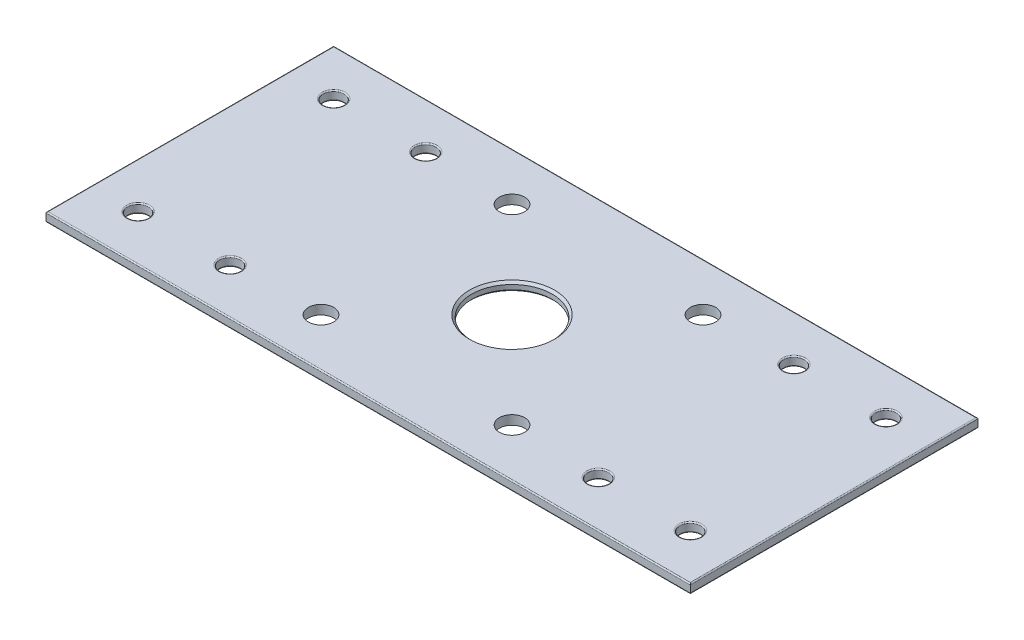
ISO-10303-21;
HEADER;
FILE_DESCRIPTION(('STEP AP214'),'2;1');
FILE_NAME('part.step','',(''),(''),'','','');
FILE_SCHEMA(('AUTOMOTIVE_DESIGN { 1 0 10303 214 1 1 1 1 }'));
ENDSEC;
DATA;
#1=APPLICATION_CONTEXT('core data for automotive mechanical design processes');
#2=APPLICATION_PROTOCOL_DEFINITION('international standard','automotive_design',2000,#1);
#3=PRODUCT_CONTEXT('',#1,'mechanical');
#4=PRODUCT('Part','Part','',(#3));
#5=PRODUCT_RELATED_PRODUCT_CATEGORY('part','',(#4));
#6=PRODUCT_DEFINITION_FORMATION('','',#4);
#7=PRODUCT_DEFINITION_CONTEXT('part definition',#1,'design');
#8=PRODUCT_DEFINITION('design','',#6,#7);
#9=PRODUCT_DEFINITION_SHAPE('','',#8);
#10=(LENGTH_UNIT() NAMED_UNIT(*) SI_UNIT(.MILLI.,.METRE.));
#11=(NAMED_UNIT(*) PLANE_ANGLE_UNIT() SI_UNIT($,.RADIAN.));
#12=(NAMED_UNIT(*) SI_UNIT($,.STERADIAN.) SOLID_ANGLE_UNIT());
#13=UNCERTAINTY_MEASURE_WITH_UNIT(LENGTH_MEASURE(1.E-05),#10,'distance_accuracy_value','');
#14=(GEOMETRIC_REPRESENTATION_CONTEXT(3) GLOBAL_UNCERTAINTY_ASSIGNED_CONTEXT((#13)) GLOBAL_UNIT_ASSIGNED_CONTEXT((#10,
#11,#12)) REPRESENTATION_CONTEXT('',''));
#15=CARTESIAN_POINT('',(0.,0.,0.));
#16=DIRECTION('',(0.,0.,1.));
#17=DIRECTION('',(1.,0.,0.));
#18=AXIS2_PLACEMENT_3D('',#15,#16,#17);
#19=CARTESIAN_POINT('',(0.,4.,0.));
#20=DIRECTION('',(0.,-1.,0.));
#21=DIRECTION('',(0.,0.,-1.));
#22=AXIS2_PLACEMENT_3D('',#19,#20,#21);
#23=PLANE('',#22);
#24=CARTESIAN_POINT('',(0.,4.,0.));
#25=DIRECTION('',(0.,-1.,0.));
#26=DIRECTION('',(0.,0.,-1.));
#27=AXIS2_PLACEMENT_3D('',#24,#25,#26);
#28=CIRCLE('',#27,18.5);
#29=CARTESIAN_POINT('',(0.,4.,-18.5));
#30=VERTEX_POINT('',#29);
#31=EDGE_CURVE('E11',#30,#30,#28,.T.);
#32=ORIENTED_EDGE('',*,*,#31,.T.);
#33=EDGE_LOOP('',(#32));
#34=FACE_BOUND('',#33,.T.);
#35=CARTESIAN_POINT('',(41.5,4.,-41.5));
#36=DIRECTION('',(0.,1.,0.));
#37=DIRECTION('',(0.,0.,1.));
#38=AXIS2_PLACEMENT_3D('',#35,#36,#37);
#39=CIRCLE('',#38,5.5);
#40=CARTESIAN_POINT('',(41.5,4.,-36.));
#41=VERTEX_POINT('',#40);
#42=EDGE_CURVE('E155',#41,#41,#39,.T.);
#43=ORIENTED_EDGE('',*,*,#42,.F.);
#44=EDGE_LOOP('',(#43));
#45=FACE_BOUND('',#44,.T.);
#46=CARTESIAN_POINT('',(-41.5,4.,-41.5));
#47=DIRECTION('',(0.,1.,0.));
#48=DIRECTION('',(0.,0.,1.));
#49=AXIS2_PLACEMENT_3D('',#46,#47,#48);
#50=CIRCLE('',#49,5.5);
#51=CARTESIAN_POINT('',(-41.5,4.,-36.));
#52=VERTEX_POINT('',#51);
#53=EDGE_CURVE('E151',#52,#52,#50,.T.);
#54=ORIENTED_EDGE('',*,*,#53,.F.);
#55=EDGE_LOOP('',(#54));
#56=FACE_BOUND('',#55,.T.);
#57=CARTESIAN_POINT('',(-41.5,4.,41.5));
#58=DIRECTION('',(0.,1.,0.));
#59=DIRECTION('',(0.,0.,1.));
#60=AXIS2_PLACEMENT_3D('',#57,#58,#59);
#61=CIRCLE('',#60,5.5);
#62=CARTESIAN_POINT('',(-41.5,4.,47.));
#63=VERTEX_POINT('',#62);
#64=EDGE_CURVE('E150',#63,#63,#61,.T.);
#65=ORIENTED_EDGE('',*,*,#64,.F.);
#66=EDGE_LOOP('',(#65));
#67=FACE_BOUND('',#66,.T.);
#68=DIRECTION('',(0.,0.,1.));
#69=VECTOR('',#68,1.);
#70=CARTESIAN_POINT('',(-139.5,4.,0.));
#71=LINE('',#70,#69);
#72=CARTESIAN_POINT('',(-139.5,4.,-62.));
#73=VERTEX_POINT('',#72);
#74=CARTESIAN_POINT('',(-139.5,4.,62.));
#75=VERTEX_POINT('',#74);
#76=EDGE_CURVE('E56',#73,#75,#71,.T.);
#77=ORIENTED_EDGE('',*,*,#76,.T.);
#78=DIRECTION('',(1.,0.,0.));
#79=VECTOR('',#78,1.);
#80=CARTESIAN_POINT('',(0.,4.,62.));
#81=LINE('',#80,#79);
#82=CARTESIAN_POINT('',(139.5,4.,62.));
#83=VERTEX_POINT('',#82);
#84=EDGE_CURVE('E160',#75,#83,#81,.T.);
#85=ORIENTED_EDGE('',*,*,#84,.T.);
#86=DIRECTION('',(0.,0.,-1.));
#87=VECTOR('',#86,1.);
#88=CARTESIAN_POINT('',(139.5,4.,0.));
#89=LINE('',#88,#87);
#90=CARTESIAN_POINT('',(139.5,4.,-62.));
#91=VERTEX_POINT('',#90);
#92=EDGE_CURVE('E325',#83,#91,#89,.T.);
#93=ORIENTED_EDGE('',*,*,#92,.T.);
#94=DIRECTION('',(-1.,0.,0.));
#95=VECTOR('',#94,1.);
#96=CARTESIAN_POINT('',(0.,4.,-62.));
#97=LINE('',#96,#95);
#98=EDGE_CURVE('E61',#91,#73,#97,.T.);
#99=ORIENTED_EDGE('',*,*,#98,.T.);
#100=EDGE_LOOP('',(#77,#85,#93,#99));
#101=FACE_BOUND('',#100,.T.);
#102=CARTESIAN_POINT('',(120.,4.,-42.5));
#103=DIRECTION('',(0.,-1.,0.));
#104=DIRECTION('',(0.,0.,-1.));
#105=AXIS2_PLACEMENT_3D('',#102,#103,#104);
#106=CIRCLE('',#105,4.99999999999999);
#107=CARTESIAN_POINT('',(120.,4.,-47.5));
#108=VERTEX_POINT('',#107);
#109=EDGE_CURVE('E322',#108,#108,#106,.T.);
#110=ORIENTED_EDGE('',*,*,#109,.T.);
#111=EDGE_LOOP('',(#110));
#112=FACE_BOUND('',#111,.T.);
#113=CARTESIAN_POINT('',(79.9999999999999,4.,-42.5));
#114=DIRECTION('',(0.,-1.,0.));
#115=DIRECTION('',(0.,0.,-1.));
#116=AXIS2_PLACEMENT_3D('',#113,#114,#115);
#117=CIRCLE('',#116,4.99999999999999);
#118=CARTESIAN_POINT('',(79.9999999999999,4.,-47.5));
#119=VERTEX_POINT('',#118);
#120=EDGE_CURVE('E319',#119,#119,#117,.T.);
#121=ORIENTED_EDGE('',*,*,#120,.T.);
#122=EDGE_LOOP('',(#121));
#123=FACE_BOUND('',#122,.T.);
#124=CARTESIAN_POINT('',(79.9999999999999,4.,42.5));
#125=DIRECTION('',(0.,-1.,0.));
#126=DIRECTION('',(0.,0.,-1.));
#127=AXIS2_PLACEMENT_3D('',#124,#125,#126);
#128=CIRCLE('',#127,4.99999999999999);
#129=CARTESIAN_POINT('',(79.9999999999999,4.,37.5));
#130=VERTEX_POINT('',#129);
#131=EDGE_CURVE('E316',#130,#130,#128,.T.);
#132=ORIENTED_EDGE('',*,*,#131,.T.);
#133=EDGE_LOOP('',(#132));
#134=FACE_BOUND('',#133,.T.);
#135=CARTESIAN_POINT('',(120.,4.,42.5));
#136=DIRECTION('',(0.,-1.,0.));
#137=DIRECTION('',(0.,0.,-1.));
#138=AXIS2_PLACEMENT_3D('',#135,#136,#137);
#139=CIRCLE('',#138,4.99999999999999);
#140=CARTESIAN_POINT('',(120.,4.,37.5));
#141=VERTEX_POINT('',#140);
#142=EDGE_CURVE('E313',#141,#141,#139,.T.);
#143=ORIENTED_EDGE('',*,*,#142,.T.);
#144=EDGE_LOOP('',(#143));
#145=FACE_BOUND('',#144,.T.);
#146=CARTESIAN_POINT('',(-120.,4.,42.4999999999999));
#147=DIRECTION('',(0.,-1.,0.));
#148=DIRECTION('',(0.,0.,-1.));
#149=AXIS2_PLACEMENT_3D('',#146,#147,#148);
#150=CIRCLE('',#149,4.99999999999999);
#151=CARTESIAN_POINT('',(-120.,4.,37.4999999999999));
#152=VERTEX_POINT('',#151);
#153=EDGE_CURVE('E310',#152,#152,#150,.T.);
#154=ORIENTED_EDGE('',*,*,#153,.T.);
#155=EDGE_LOOP('',(#154));
#156=FACE_BOUND('',#155,.T.);
#157=CARTESIAN_POINT('',(-79.9999999999999,4.,42.4999999999999));
#158=DIRECTION('',(0.,-1.,0.));
#159=DIRECTION('',(0.,0.,-1.));
#160=AXIS2_PLACEMENT_3D('',#157,#158,#159);
#161=CIRCLE('',#160,4.99999999999999);
#162=CARTESIAN_POINT('',(-79.9999999999999,4.,37.4999999999999));
#163=VERTEX_POINT('',#162);
#164=EDGE_CURVE('E307',#163,#163,#161,.T.);
#165=ORIENTED_EDGE('',*,*,#164,.T.);
#166=EDGE_LOOP('',(#165));
#167=FACE_BOUND('',#166,.T.);
#168=CARTESIAN_POINT('',(-79.9999999999999,4.,-42.4999999999999));
#169=DIRECTION('',(0.,-1.,0.));
#170=DIRECTION('',(0.,0.,-1.));
#171=AXIS2_PLACEMENT_3D('',#168,#169,#170);
#172=CIRCLE('',#171,4.99999999999999);
#173=CARTESIAN_POINT('',(-79.9999999999999,4.,-47.4999999999999));
#174=VERTEX_POINT('',#173);
#175=EDGE_CURVE('E304',#174,#174,#172,.T.);
#176=ORIENTED_EDGE('',*,*,#175,.T.);
#177=EDGE_LOOP('',(#176));
#178=FACE_BOUND('',#177,.T.);
#179=CARTESIAN_POINT('',(-120.,4.,-42.4999999999999));
#180=DIRECTION('',(0.,-1.,0.));
#181=DIRECTION('',(0.,0.,-1.));
#182=AXIS2_PLACEMENT_3D('',#179,#180,#181);
#183=CIRCLE('',#182,4.99999999999999);
#184=CARTESIAN_POINT('',(-120.,4.,-47.4999999999999));
#185=VERTEX_POINT('',#184);
#186=EDGE_CURVE('E301',#185,#185,#183,.T.);
#187=ORIENTED_EDGE('',*,*,#186,.T.);
#188=EDGE_LOOP('',(#187));
#189=FACE_BOUND('',#188,.T.);
#190=CARTESIAN_POINT('',(41.5,4.,41.5));
#191=DIRECTION('',(0.,1.,0.));
#192=DIRECTION('',(0.,0.,1.));
#193=AXIS2_PLACEMENT_3D('',#190,#191,#192);
#194=CIRCLE('',#193,5.5);
#195=CARTESIAN_POINT('',(41.5,4.,47.));
#196=VERTEX_POINT('',#195);
#197=EDGE_CURVE('E834',#196,#196,#194,.T.);
#198=ORIENTED_EDGE('',*,*,#197,.F.);
#199=EDGE_LOOP('',(#198));
#200=FACE_BOUND('',#199,.T.);
#201=ADVANCED_FACE('F40',(#34,#45,#56,#67,#101,#112,#123,#134,#145,#156,#167,#178,#189,#200),
#23,.F.);
#202=CARTESIAN_POINT('',(140.,4.,62.5));
#203=DIRECTION('',(-1.,0.,0.));
#204=DIRECTION('',(0.,0.,1.));
#205=AXIS2_PLACEMENT_3D('',#202,#203,#204);
#206=PLANE('',#205);
#207=DIRECTION('',(0.,-1.,0.));
#208=VECTOR('',#207,1.);
#209=CARTESIAN_POINT('',(140.,4.,62.5));
#210=LINE('',#209,#208);
#211=CARTESIAN_POINT('',(140.,3.5,62.5));
#212=VERTEX_POINT('',#211);
#213=CARTESIAN_POINT('',(140.,0.5,62.5));
#214=VERTEX_POINT('',#213);
#215=EDGE_CURVE('E337',#212,#214,#210,.T.);
#216=ORIENTED_EDGE('',*,*,#215,.T.);
#217=DIRECTION('',(0.,0.,-1.));
#218=VECTOR('',#217,1.);
#219=CARTESIAN_POINT('',(140.,0.5,-62.5));
#220=LINE('',#219,#218);
#221=CARTESIAN_POINT('',(140.,0.5,-62.5));
#222=VERTEX_POINT('',#221);
#223=EDGE_CURVE('E251',#214,#222,#220,.T.);
#224=ORIENTED_EDGE('',*,*,#223,.T.);
#225=DIRECTION('',(0.,-1.,0.));
#226=VECTOR('',#225,1.);
#227=CARTESIAN_POINT('',(140.,4.,-62.5));
#228=LINE('',#227,#226);
#229=CARTESIAN_POINT('',(140.,3.5,-62.5));
#230=VERTEX_POINT('',#229);
#231=EDGE_CURVE('E128',#230,#222,#228,.T.);
#232=ORIENTED_EDGE('',*,*,#231,.F.);
#233=DIRECTION('',(0.,0.,-1.));
#234=VECTOR('',#233,1.);
#235=CARTESIAN_POINT('',(140.,3.5,62.5));
#236=LINE('',#235,#234);
#237=EDGE_CURVE('E249',#230,#212,#236,.F.);
#238=ORIENTED_EDGE('',*,*,#237,.T.);
#239=EDGE_LOOP('',(#216,#224,#232,#238));
#240=FACE_BOUND('',#239,.T.);
#241=ADVANCED_FACE('F351',(#240),#206,.F.);
#242=CARTESIAN_POINT('',(-140.,4.,-62.5));
#243=DIRECTION('',(0.,0.,1.));
#244=DIRECTION('',(1.,0.,0.));
#245=AXIS2_PLACEMENT_3D('',#242,#243,#244);
#246=PLANE('',#245);
#247=ORIENTED_EDGE('',*,*,#231,.T.);
#248=DIRECTION('',(-1.,0.,0.));
#249=VECTOR('',#248,1.);
#250=CARTESIAN_POINT('',(-140.,0.5,-62.5));
#251=LINE('',#250,#249);
#252=CARTESIAN_POINT('',(-140.,0.5,-62.5));
#253=VERTEX_POINT('',#252);
#254=EDGE_CURVE('E127',#222,#253,#251,.T.);
#255=ORIENTED_EDGE('',*,*,#254,.T.);
#256=DIRECTION('',(0.,-1.,0.));
#257=VECTOR('',#256,1.);
#258=CARTESIAN_POINT('',(-140.,4.,-62.5));
#259=LINE('',#258,#257);
#260=CARTESIAN_POINT('',(-140.,3.5,-62.5));
#261=VERTEX_POINT('',#260);
#262=EDGE_CURVE('E110',#261,#253,#259,.T.);
#263=ORIENTED_EDGE('',*,*,#262,.F.);
#264=DIRECTION('',(-1.,0.,0.));
#265=VECTOR('',#264,1.);
#266=CARTESIAN_POINT('',(-140.,3.5,-62.5));
#267=LINE('',#266,#265);
#268=EDGE_CURVE('E124',#261,#230,#267,.F.);
#269=ORIENTED_EDGE('',*,*,#268,.T.);
#270=EDGE_LOOP('',(#247,#255,#263,#269));
#271=FACE_BOUND('',#270,.T.);
#272=ADVANCED_FACE('F123',(#271),#246,.F.);
#273=CARTESIAN_POINT('',(-140.,4.,62.5));
#274=DIRECTION('',(1.,0.,0.));
#275=DIRECTION('',(0.,0.,-1.));
#276=AXIS2_PLACEMENT_3D('',#273,#274,#275);
#277=PLANE('',#276);
#278=ORIENTED_EDGE('',*,*,#262,.T.);
#279=DIRECTION('',(0.,0.,1.));
#280=VECTOR('',#279,1.);
#281=CARTESIAN_POINT('',(-140.,0.5,62.5));
#282=LINE('',#281,#280);
#283=CARTESIAN_POINT('',(-140.,0.5,62.5));
#284=VERTEX_POINT('',#283);
#285=EDGE_CURVE('E116',#253,#284,#282,.T.);
#286=ORIENTED_EDGE('',*,*,#285,.T.);
#287=DIRECTION('',(0.,-1.,0.));
#288=VECTOR('',#287,1.);
#289=CARTESIAN_POINT('',(-140.,4.,62.5));
#290=LINE('',#289,#288);
#291=CARTESIAN_POINT('',(-140.,3.5,62.5));
#292=VERTEX_POINT('',#291);
#293=EDGE_CURVE('E112',#292,#284,#290,.T.);
#294=ORIENTED_EDGE('',*,*,#293,.F.);
#295=DIRECTION('',(0.,0.,1.));
#296=VECTOR('',#295,1.);
#297=CARTESIAN_POINT('',(-140.,3.5,62.5));
#298=LINE('',#297,#296);
#299=EDGE_CURVE('E107',#292,#261,#298,.F.);
#300=ORIENTED_EDGE('',*,*,#299,.T.);
#301=EDGE_LOOP('',(#278,#286,#294,#300));
#302=FACE_BOUND('',#301,.T.);
#303=ADVANCED_FACE('F109',(#302),#277,.F.);
#304=CARTESIAN_POINT('',(-140.,4.,62.5));
#305=DIRECTION('',(0.,0.,-1.));
#306=DIRECTION('',(-1.,0.,0.));
#307=AXIS2_PLACEMENT_3D('',#304,#305,#306);
#308=PLANE('',#307);
#309=ORIENTED_EDGE('',*,*,#293,.T.);
#310=DIRECTION('',(1.,0.,0.));
#311=VECTOR('',#310,1.);
#312=CARTESIAN_POINT('',(140.,0.5,62.5));
#313=LINE('',#312,#311);
#314=EDGE_CURVE('E247',#284,#214,#313,.T.);
#315=ORIENTED_EDGE('',*,*,#314,.T.);
#316=ORIENTED_EDGE('',*,*,#215,.F.);
#317=DIRECTION('',(1.,0.,0.));
#318=VECTOR('',#317,1.);
#319=CARTESIAN_POINT('',(-140.,3.5,62.5));
#320=LINE('',#319,#318);
#321=EDGE_CURVE('E245',#212,#292,#320,.F.);
#322=ORIENTED_EDGE('',*,*,#321,.T.);
#323=EDGE_LOOP('',(#309,#315,#316,#322));
#324=FACE_BOUND('',#323,.T.);
#325=ADVANCED_FACE('F177',(#324),#308,.F.);
#326=CARTESIAN_POINT('',(0.,0.,0.));
#327=DIRECTION('',(0.,-1.,0.));
#328=DIRECTION('',(0.,0.,-1.));
#329=AXIS2_PLACEMENT_3D('',#326,#327,#328);
#330=PLANE('',#329);
#331=CARTESIAN_POINT('',(0.,0.,0.));
#332=DIRECTION('',(0.,-1.,0.));
#333=DIRECTION('',(0.,0.,-1.));
#334=AXIS2_PLACEMENT_3D('',#331,#332,#333);
#335=CIRCLE('',#334,18.5);
#336=CARTESIAN_POINT('',(0.,0.,-18.5));
#337=VERTEX_POINT('',#336);
#338=EDGE_CURVE('E156',#337,#337,#335,.F.);
#339=ORIENTED_EDGE('',*,*,#338,.T.);
#340=EDGE_LOOP('',(#339));
#341=FACE_BOUND('',#340,.T.);
#342=CARTESIAN_POINT('',(41.5,0.,-41.5));
#343=DIRECTION('',(0.,-1.,0.));
#344=DIRECTION('',(0.,0.,-1.));
#345=AXIS2_PLACEMENT_3D('',#342,#343,#344);
#346=CIRCLE('',#345,5.5);
#347=CARTESIAN_POINT('',(41.5,0.,-47.));
#348=VERTEX_POINT('',#347);
#349=EDGE_CURVE('E152',#348,#348,#346,.T.);
#350=ORIENTED_EDGE('',*,*,#349,.F.);
#351=EDGE_LOOP('',(#350));
#352=FACE_BOUND('',#351,.T.);
#353=CARTESIAN_POINT('',(-41.5,0.,-41.5));
#354=DIRECTION('',(0.,-1.,0.));
#355=DIRECTION('',(0.,0.,-1.));
#356=AXIS2_PLACEMENT_3D('',#353,#354,#355);
#357=CIRCLE('',#356,5.5);
#358=CARTESIAN_POINT('',(-41.5,0.,-47.));
#359=VERTEX_POINT('',#358);
#360=EDGE_CURVE('E147',#359,#359,#357,.T.);
#361=ORIENTED_EDGE('',*,*,#360,.F.);
#362=EDGE_LOOP('',(#361));
#363=FACE_BOUND('',#362,.T.);
#364=CARTESIAN_POINT('',(-41.5,0.,41.5));
#365=DIRECTION('',(0.,-1.,0.));
#366=DIRECTION('',(0.,0.,-1.));
#367=AXIS2_PLACEMENT_3D('',#364,#365,#366);
#368=CIRCLE('',#367,5.5);
#369=CARTESIAN_POINT('',(-41.5,0.,36.));
#370=VERTEX_POINT('',#369);
#371=EDGE_CURVE('E186',#370,#370,#368,.T.);
#372=ORIENTED_EDGE('',*,*,#371,.F.);
#373=EDGE_LOOP('',(#372));
#374=FACE_BOUND('',#373,.T.);
#375=CARTESIAN_POINT('',(41.5,0.,41.5));
#376=DIRECTION('',(0.,-1.,0.));
#377=DIRECTION('',(0.,0.,-1.));
#378=AXIS2_PLACEMENT_3D('',#375,#376,#377);
#379=CIRCLE('',#378,5.5);
#380=CARTESIAN_POINT('',(41.5,0.,36.));
#381=VERTEX_POINT('',#380);
#382=EDGE_CURVE('E190',#381,#381,#379,.T.);
#383=ORIENTED_EDGE('',*,*,#382,.F.);
#384=EDGE_LOOP('',(#383));
#385=FACE_BOUND('',#384,.T.);
#386=DIRECTION('',(0.,0.,1.));
#387=VECTOR('',#386,1.);
#388=CARTESIAN_POINT('',(-139.5,0.,-62.5));
#389=LINE('',#388,#387);
#390=CARTESIAN_POINT('',(-139.5,0.,62.));
#391=VERTEX_POINT('',#390);
#392=CARTESIAN_POINT('',(-139.5,0.,-62.));
#393=VERTEX_POINT('',#392);
#394=EDGE_CURVE('E194',#391,#393,#389,.F.);
#395=ORIENTED_EDGE('',*,*,#394,.T.);
#396=DIRECTION('',(-1.,0.,0.));
#397=VECTOR('',#396,1.);
#398=CARTESIAN_POINT('',(140.,0.,-62.));
#399=LINE('',#398,#397);
#400=CARTESIAN_POINT('',(139.5,0.,-62.));
#401=VERTEX_POINT('',#400);
#402=EDGE_CURVE('E117',#393,#401,#399,.F.);
#403=ORIENTED_EDGE('',*,*,#402,.T.);
#404=DIRECTION('',(0.,0.,-1.));
#405=VECTOR('',#404,1.);
#406=CARTESIAN_POINT('',(139.5,0.,62.5));
#407=LINE('',#406,#405);
#408=CARTESIAN_POINT('',(139.5,0.,62.));
#409=VERTEX_POINT('',#408);
#410=EDGE_CURVE('E238',#401,#409,#407,.F.);
#411=ORIENTED_EDGE('',*,*,#410,.T.);
#412=DIRECTION('',(1.,0.,0.));
#413=VECTOR('',#412,1.);
#414=CARTESIAN_POINT('',(-140.,0.,62.));
#415=LINE('',#414,#413);
#416=EDGE_CURVE('E240',#409,#391,#415,.F.);
#417=ORIENTED_EDGE('',*,*,#416,.T.);
#418=EDGE_LOOP('',(#395,#403,#411,#417));
#419=FACE_BOUND('',#418,.T.);
#420=CARTESIAN_POINT('',(120.,0.,-42.5));
#421=DIRECTION('',(0.,-1.,0.));
#422=DIRECTION('',(0.,0.,-1.));
#423=AXIS2_PLACEMENT_3D('',#420,#421,#422);
#424=CIRCLE('',#423,4.99999999999999);
#425=CARTESIAN_POINT('',(120.,0.,-47.5));
#426=VERTEX_POINT('',#425);
#427=EDGE_CURVE('E199',#426,#426,#424,.F.);
#428=ORIENTED_EDGE('',*,*,#427,.T.);
#429=EDGE_LOOP('',(#428));
#430=FACE_BOUND('',#429,.T.);
#431=CARTESIAN_POINT('',(79.9999999999999,0.,-42.5));
#432=DIRECTION('',(0.,-1.,0.));
#433=DIRECTION('',(0.,0.,-1.));
#434=AXIS2_PLACEMENT_3D('',#431,#432,#433);
#435=CIRCLE('',#434,4.99999999999999);
#436=CARTESIAN_POINT('',(79.9999999999999,0.,-47.5));
#437=VERTEX_POINT('',#436);
#438=EDGE_CURVE('E203',#437,#437,#435,.F.);
#439=ORIENTED_EDGE('',*,*,#438,.T.);
#440=EDGE_LOOP('',(#439));
#441=FACE_BOUND('',#440,.T.);
#442=CARTESIAN_POINT('',(79.9999999999999,0.,42.5));
#443=DIRECTION('',(0.,-1.,0.));
#444=DIRECTION('',(0.,0.,-1.));
#445=AXIS2_PLACEMENT_3D('',#442,#443,#444);
#446=CIRCLE('',#445,4.99999999999999);
#447=CARTESIAN_POINT('',(79.9999999999999,0.,37.5));
#448=VERTEX_POINT('',#447);
#449=EDGE_CURVE('E207',#448,#448,#446,.F.);
#450=ORIENTED_EDGE('',*,*,#449,.T.);
#451=EDGE_LOOP('',(#450));
#452=FACE_BOUND('',#451,.T.);
#453=CARTESIAN_POINT('',(120.,0.,42.5));
#454=DIRECTION('',(0.,-1.,0.));
#455=DIRECTION('',(0.,0.,-1.));
#456=AXIS2_PLACEMENT_3D('',#453,#454,#455);
#457=CIRCLE('',#456,4.99999999999999);
#458=CARTESIAN_POINT('',(120.,0.,37.5));
#459=VERTEX_POINT('',#458);
#460=EDGE_CURVE('E211',#459,#459,#457,.F.);
#461=ORIENTED_EDGE('',*,*,#460,.T.);
#462=EDGE_LOOP('',(#461));
#463=FACE_BOUND('',#462,.T.);
#464=CARTESIAN_POINT('',(-120.,0.,42.4999999999999));
#465=DIRECTION('',(0.,-1.,0.));
#466=DIRECTION('',(0.,0.,-1.));
#467=AXIS2_PLACEMENT_3D('',#464,#465,#466);
#468=CIRCLE('',#467,4.99999999999999);
#469=CARTESIAN_POINT('',(-120.,0.,37.4999999999999));
#470=VERTEX_POINT('',#469);
#471=EDGE_CURVE('E215',#470,#470,#468,.F.);
#472=ORIENTED_EDGE('',*,*,#471,.T.);
#473=EDGE_LOOP('',(#472));
#474=FACE_BOUND('',#473,.T.);
#475=CARTESIAN_POINT('',(-79.9999999999999,0.,42.4999999999999));
#476=DIRECTION('',(0.,-1.,0.));
#477=DIRECTION('',(0.,0.,-1.));
#478=AXIS2_PLACEMENT_3D('',#475,#476,#477);
#479=CIRCLE('',#478,4.99999999999999);
#480=CARTESIAN_POINT('',(-79.9999999999999,0.,37.4999999999999));
#481=VERTEX_POINT('',#480);
#482=EDGE_CURVE('E219',#481,#481,#479,.F.);
#483=ORIENTED_EDGE('',*,*,#482,.T.);
#484=EDGE_LOOP('',(#483));
#485=FACE_BOUND('',#484,.T.);
#486=CARTESIAN_POINT('',(-79.9999999999999,0.,-42.4999999999999));
#487=DIRECTION('',(0.,-1.,0.));
#488=DIRECTION('',(0.,0.,-1.));
#489=AXIS2_PLACEMENT_3D('',#486,#487,#488);
#490=CIRCLE('',#489,4.99999999999999);
#491=CARTESIAN_POINT('',(-79.9999999999999,0.,-47.4999999999999));
#492=VERTEX_POINT('',#491);
#493=EDGE_CURVE('E223',#492,#492,#490,.F.);
#494=ORIENTED_EDGE('',*,*,#493,.T.);
#495=EDGE_LOOP('',(#494));
#496=FACE_BOUND('',#495,.T.);
#497=CARTESIAN_POINT('',(-120.,0.,-42.4999999999999));
#498=DIRECTION('',(0.,-1.,0.));
#499=DIRECTION('',(0.,0.,-1.));
#500=AXIS2_PLACEMENT_3D('',#497,#498,#499);
#501=CIRCLE('',#500,4.99999999999999);
#502=CARTESIAN_POINT('',(-120.,0.,-47.4999999999999));
#503=VERTEX_POINT('',#502);
#504=EDGE_CURVE('E226',#503,#503,#501,.F.);
#505=ORIENTED_EDGE('',*,*,#504,.T.);
#506=EDGE_LOOP('',(#505));
#507=FACE_BOUND('',#506,.T.);
#508=ADVANCED_FACE('F173',(#341,#352,#363,#374,#385,#419,#430,#441,#452,#463,#474,#485,#496,
#507),#330,.T.);
#509=CARTESIAN_POINT('',(120.,4.,-42.5));
#510=DIRECTION('',(0.,1.,0.));
#511=DIRECTION('',(0.,0.,1.));
#512=AXIS2_PLACEMENT_3D('',#509,#510,#511);
#513=CYLINDRICAL_SURFACE('',#512,4.49999999999999);
#514=CARTESIAN_POINT('',(120.,0.5,-42.5));
#515=DIRECTION('',(0.,-1.,0.));
#516=DIRECTION('',(0.,0.,-1.));
#517=AXIS2_PLACEMENT_3D('',#514,#515,#516);
#518=CIRCLE('',#517,4.49999999999999);
#519=CARTESIAN_POINT('',(120.,0.5,-47.));
#520=VERTEX_POINT('',#519);
#521=EDGE_CURVE('E256',#520,#520,#518,.T.);
#522=ORIENTED_EDGE('',*,*,#521,.T.);
#523=EDGE_LOOP('',(#522));
#524=FACE_BOUND('',#523,.T.);
#525=CARTESIAN_POINT('',(120.,3.5,-42.5));
#526=DIRECTION('',(0.,-1.,0.));
#527=DIRECTION('',(0.,0.,-1.));
#528=AXIS2_PLACEMENT_3D('',#525,#526,#527);
#529=CIRCLE('',#528,4.49999999999999);
#530=CARTESIAN_POINT('',(120.,3.5,-47.));
#531=VERTEX_POINT('',#530);
#532=EDGE_CURVE('E253',#531,#531,#529,.F.);
#533=ORIENTED_EDGE('',*,*,#532,.T.);
#534=EDGE_LOOP('',(#533));
#535=FACE_BOUND('',#534,.T.);
#536=ADVANCED_FACE('F176',(#524,#535),#513,.F.);
#537=CARTESIAN_POINT('',(79.9999999999999,4.,-42.5));
#538=DIRECTION('',(0.,1.,0.));
#539=DIRECTION('',(0.,0.,1.));
#540=AXIS2_PLACEMENT_3D('',#537,#538,#539);
#541=CYLINDRICAL_SURFACE('',#540,4.49999999999999);
#542=CARTESIAN_POINT('',(79.9999999999999,0.5,-42.5));
#543=DIRECTION('',(0.,-1.,0.));
#544=DIRECTION('',(0.,0.,-1.));
#545=AXIS2_PLACEMENT_3D('',#542,#543,#544);
#546=CIRCLE('',#545,4.49999999999999);
#547=CARTESIAN_POINT('',(79.9999999999999,0.5,-47.));
#548=VERTEX_POINT('',#547);
#549=EDGE_CURVE('E262',#548,#548,#546,.T.);
#550=ORIENTED_EDGE('',*,*,#549,.T.);
#551=EDGE_LOOP('',(#550));
#552=FACE_BOUND('',#551,.T.);
#553=CARTESIAN_POINT('',(79.9999999999999,3.5,-42.5));
#554=DIRECTION('',(0.,-1.,0.));
#555=DIRECTION('',(0.,0.,-1.));
#556=AXIS2_PLACEMENT_3D('',#553,#554,#555);
#557=CIRCLE('',#556,4.49999999999999);
#558=CARTESIAN_POINT('',(79.9999999999999,3.5,-47.));
#559=VERTEX_POINT('',#558);
#560=EDGE_CURVE('E259',#559,#559,#557,.F.);
#561=ORIENTED_EDGE('',*,*,#560,.T.);
#562=EDGE_LOOP('',(#561));
#563=FACE_BOUND('',#562,.T.);
#564=ADVANCED_FACE('F733',(#552,#563),#541,.F.);
#565=CARTESIAN_POINT('',(79.9999999999999,4.,42.5));
#566=DIRECTION('',(0.,1.,0.));
#567=DIRECTION('',(0.,0.,1.));
#568=AXIS2_PLACEMENT_3D('',#565,#566,#567);
#569=CYLINDRICAL_SURFACE('',#568,4.49999999999999);
#570=CARTESIAN_POINT('',(79.9999999999999,0.5,42.5));
#571=DIRECTION('',(0.,-1.,0.));
#572=DIRECTION('',(0.,0.,-1.));
#573=AXIS2_PLACEMENT_3D('',#570,#571,#572);
#574=CIRCLE('',#573,4.49999999999999);
#575=CARTESIAN_POINT('',(79.9999999999999,0.5,38.));
#576=VERTEX_POINT('',#575);
#577=EDGE_CURVE('E268',#576,#576,#574,.T.);
#578=ORIENTED_EDGE('',*,*,#577,.T.);
#579=EDGE_LOOP('',(#578));
#580=FACE_BOUND('',#579,.T.);
#581=CARTESIAN_POINT('',(79.9999999999999,3.5,42.5));
#582=DIRECTION('',(0.,-1.,0.));
#583=DIRECTION('',(0.,0.,-1.));
#584=AXIS2_PLACEMENT_3D('',#581,#582,#583);
#585=CIRCLE('',#584,4.49999999999999);
#586=CARTESIAN_POINT('',(79.9999999999999,3.5,38.));
#587=VERTEX_POINT('',#586);
#588=EDGE_CURVE('E265',#587,#587,#585,.F.);
#589=ORIENTED_EDGE('',*,*,#588,.T.);
#590=EDGE_LOOP('',(#589));
#591=FACE_BOUND('',#590,.T.);
#592=ADVANCED_FACE('F724',(#580,#591),#569,.F.);
#593=CARTESIAN_POINT('',(120.,4.,42.5));
#594=DIRECTION('',(0.,1.,0.));
#595=DIRECTION('',(0.,0.,1.));
#596=AXIS2_PLACEMENT_3D('',#593,#594,#595);
#597=CYLINDRICAL_SURFACE('',#596,4.49999999999999);
#598=CARTESIAN_POINT('',(120.,0.5,42.5));
#599=DIRECTION('',(0.,-1.,0.));
#600=DIRECTION('',(0.,0.,-1.));
#601=AXIS2_PLACEMENT_3D('',#598,#599,#600);
#602=CIRCLE('',#601,4.49999999999999);
#603=CARTESIAN_POINT('',(120.,0.5,38.));
#604=VERTEX_POINT('',#603);
#605=EDGE_CURVE('E274',#604,#604,#602,.T.);
#606=ORIENTED_EDGE('',*,*,#605,.T.);
#607=EDGE_LOOP('',(#606));
#608=FACE_BOUND('',#607,.T.);
#609=CARTESIAN_POINT('',(120.,3.5,42.5));
#610=DIRECTION('',(0.,-1.,0.));
#611=DIRECTION('',(0.,0.,-1.));
#612=AXIS2_PLACEMENT_3D('',#609,#610,#611);
#613=CIRCLE('',#612,4.49999999999999);
#614=CARTESIAN_POINT('',(120.,3.5,38.));
#615=VERTEX_POINT('',#614);
#616=EDGE_CURVE('E271',#615,#615,#613,.F.);
#617=ORIENTED_EDGE('',*,*,#616,.T.);
#618=EDGE_LOOP('',(#617));
#619=FACE_BOUND('',#618,.T.);
#620=ADVANCED_FACE('F715',(#608,#619),#597,.F.);
#621=CARTESIAN_POINT('',(-120.,4.,42.4999999999999));
#622=DIRECTION('',(0.,1.,0.));
#623=DIRECTION('',(0.,0.,1.));
#624=AXIS2_PLACEMENT_3D('',#621,#622,#623);
#625=CYLINDRICAL_SURFACE('',#624,4.49999999999999);
#626=CARTESIAN_POINT('',(-120.,0.5,42.4999999999999));
#627=DIRECTION('',(0.,-1.,0.));
#628=DIRECTION('',(0.,0.,-1.));
#629=AXIS2_PLACEMENT_3D('',#626,#627,#628);
#630=CIRCLE('',#629,4.49999999999999);
#631=CARTESIAN_POINT('',(-120.,0.5,37.9999999999999));
#632=VERTEX_POINT('',#631);
#633=EDGE_CURVE('E280',#632,#632,#630,.T.);
#634=ORIENTED_EDGE('',*,*,#633,.T.);
#635=EDGE_LOOP('',(#634));
#636=FACE_BOUND('',#635,.T.);
#637=CARTESIAN_POINT('',(-120.,3.5,42.4999999999999));
#638=DIRECTION('',(0.,-1.,0.));
#639=DIRECTION('',(0.,0.,-1.));
#640=AXIS2_PLACEMENT_3D('',#637,#638,#639);
#641=CIRCLE('',#640,4.49999999999999);
#642=CARTESIAN_POINT('',(-120.,3.5,37.9999999999999));
#643=VERTEX_POINT('',#642);
#644=EDGE_CURVE('E277',#643,#643,#641,.F.);
#645=ORIENTED_EDGE('',*,*,#644,.T.);
#646=EDGE_LOOP('',(#645));
#647=FACE_BOUND('',#646,.T.);
#648=ADVANCED_FACE('F706',(#636,#647),#625,.F.);
#649=CARTESIAN_POINT('',(-79.9999999999999,4.,42.4999999999999));
#650=DIRECTION('',(0.,1.,0.));
#651=DIRECTION('',(0.,0.,1.));
#652=AXIS2_PLACEMENT_3D('',#649,#650,#651);
#653=CYLINDRICAL_SURFACE('',#652,4.49999999999999);
#654=CARTESIAN_POINT('',(-79.9999999999999,0.5,42.4999999999999));
#655=DIRECTION('',(0.,-1.,0.));
#656=DIRECTION('',(0.,0.,-1.));
#657=AXIS2_PLACEMENT_3D('',#654,#655,#656);
#658=CIRCLE('',#657,4.49999999999999);
#659=CARTESIAN_POINT('',(-79.9999999999999,0.5,37.9999999999999));
#660=VERTEX_POINT('',#659);
#661=EDGE_CURVE('E286',#660,#660,#658,.T.);
#662=ORIENTED_EDGE('',*,*,#661,.T.);
#663=EDGE_LOOP('',(#662));
#664=FACE_BOUND('',#663,.T.);
#665=CARTESIAN_POINT('',(-79.9999999999999,3.5,42.4999999999999));
#666=DIRECTION('',(0.,-1.,0.));
#667=DIRECTION('',(0.,0.,-1.));
#668=AXIS2_PLACEMENT_3D('',#665,#666,#667);
#669=CIRCLE('',#668,4.49999999999999);
#670=CARTESIAN_POINT('',(-79.9999999999999,3.5,37.9999999999999));
#671=VERTEX_POINT('',#670);
#672=EDGE_CURVE('E283',#671,#671,#669,.F.);
#673=ORIENTED_EDGE('',*,*,#672,.T.);
#674=EDGE_LOOP('',(#673));
#675=FACE_BOUND('',#674,.T.);
#676=ADVANCED_FACE('F697',(#664,#675),#653,.F.);
#677=CARTESIAN_POINT('',(-79.9999999999999,4.,-42.4999999999999));
#678=DIRECTION('',(0.,1.,0.));
#679=DIRECTION('',(0.,0.,1.));
#680=AXIS2_PLACEMENT_3D('',#677,#678,#679);
#681=CYLINDRICAL_SURFACE('',#680,4.49999999999999);
#682=CARTESIAN_POINT('',(-79.9999999999999,0.5,-42.4999999999999));
#683=DIRECTION('',(0.,-1.,0.));
#684=DIRECTION('',(0.,0.,-1.));
#685=AXIS2_PLACEMENT_3D('',#682,#683,#684);
#686=CIRCLE('',#685,4.49999999999999);
#687=CARTESIAN_POINT('',(-79.9999999999999,0.5,-46.9999999999999));
#688=VERTEX_POINT('',#687);
#689=EDGE_CURVE('E292',#688,#688,#686,.T.);
#690=ORIENTED_EDGE('',*,*,#689,.T.);
#691=EDGE_LOOP('',(#690));
#692=FACE_BOUND('',#691,.T.);
#693=CARTESIAN_POINT('',(-79.9999999999999,3.5,-42.4999999999999));
#694=DIRECTION('',(0.,-1.,0.));
#695=DIRECTION('',(0.,0.,-1.));
#696=AXIS2_PLACEMENT_3D('',#693,#694,#695);
#697=CIRCLE('',#696,4.49999999999999);
#698=CARTESIAN_POINT('',(-79.9999999999999,3.5,-46.9999999999999));
#699=VERTEX_POINT('',#698);
#700=EDGE_CURVE('E289',#699,#699,#697,.F.);
#701=ORIENTED_EDGE('',*,*,#700,.T.);
#702=EDGE_LOOP('',(#701));
#703=FACE_BOUND('',#702,.T.);
#704=ADVANCED_FACE('F383',(#692,#703),#681,.F.);
#705=CARTESIAN_POINT('',(-120.,4.,-42.4999999999999));
#706=DIRECTION('',(0.,1.,0.));
#707=DIRECTION('',(0.,0.,1.));
#708=AXIS2_PLACEMENT_3D('',#705,#706,#707);
#709=CYLINDRICAL_SURFACE('',#708,4.49999999999999);
#710=CARTESIAN_POINT('',(-120.,0.5,-42.4999999999999));
#711=DIRECTION('',(0.,-1.,0.));
#712=DIRECTION('',(0.,0.,-1.));
#713=AXIS2_PLACEMENT_3D('',#710,#711,#712);
#714=CIRCLE('',#713,4.49999999999999);
#715=CARTESIAN_POINT('',(-120.,0.5,-46.9999999999999));
#716=VERTEX_POINT('',#715);
#717=EDGE_CURVE('E298',#716,#716,#714,.T.);
#718=ORIENTED_EDGE('',*,*,#717,.T.);
#719=EDGE_LOOP('',(#718));
#720=FACE_BOUND('',#719,.T.);
#721=CARTESIAN_POINT('',(-120.,3.5,-42.4999999999999));
#722=DIRECTION('',(0.,-1.,0.));
#723=DIRECTION('',(0.,0.,-1.));
#724=AXIS2_PLACEMENT_3D('',#721,#722,#723);
#725=CIRCLE('',#724,4.49999999999999);
#726=CARTESIAN_POINT('',(-120.,3.5,-46.9999999999999));
#727=VERTEX_POINT('',#726);
#728=EDGE_CURVE('E295',#727,#727,#725,.F.);
#729=ORIENTED_EDGE('',*,*,#728,.T.);
#730=EDGE_LOOP('',(#729));
#731=FACE_BOUND('',#730,.T.);
#732=ADVANCED_FACE('F376',(#720,#731),#709,.F.);
#733=CARTESIAN_POINT('',(-140.,0.5,62.));
#734=DIRECTION('',(-1.,0.,0.));
#735=DIRECTION('',(0.,0.,1.));
#736=AXIS2_PLACEMENT_3D('',#733,#734,#735);
#737=CYLINDRICAL_SURFACE('',#736,0.5);
#738=CARTESIAN_POINT('',(-139.5,0.5,62.));
#739=DIRECTION('',(-0.707106781186547,0.,-0.707106781186547));
#740=DIRECTION('',(-0.707106781186547,0.,0.707106781186547));
#741=AXIS2_PLACEMENT_3D('',#738,#739,#740);
#742=ELLIPSE('',#741,0.707106781186547,0.5);
#743=EDGE_CURVE('E331',#391,#284,#742,.T.);
#744=ORIENTED_EDGE('',*,*,#743,.F.);
#745=ORIENTED_EDGE('',*,*,#416,.F.);
#746=CARTESIAN_POINT('',(139.5,0.5,62.));
#747=DIRECTION('',(-0.707106781186547,0.,0.707106781186547));
#748=DIRECTION('',(0.707106781186547,0.,0.707106781186547));
#749=AXIS2_PLACEMENT_3D('',#746,#747,#748);
#750=ELLIPSE('',#749,0.707106781186547,0.5);
#751=EDGE_CURVE('E334',#214,#409,#750,.F.);
#752=ORIENTED_EDGE('',*,*,#751,.F.);
#753=ORIENTED_EDGE('',*,*,#314,.F.);
#754=EDGE_LOOP('',(#744,#745,#752,#753));
#755=FACE_BOUND('',#754,.T.);
#756=ADVANCED_FACE('F373',(#755),#737,.T.);
#757=CARTESIAN_POINT('',(139.5,0.5,62.5));
#758=DIRECTION('',(0.,0.,1.));
#759=DIRECTION('',(1.,0.,0.));
#760=AXIS2_PLACEMENT_3D('',#757,#758,#759);
#761=CYLINDRICAL_SURFACE('',#760,0.5);
#762=ORIENTED_EDGE('',*,*,#751,.T.);
#763=ORIENTED_EDGE('',*,*,#410,.F.);
#764=CARTESIAN_POINT('',(139.5,0.5,-62.));
#765=DIRECTION('',(0.707106781186547,0.,0.707106781186547));
#766=DIRECTION('',(-0.707106781186547,0.,0.707106781186547));
#767=AXIS2_PLACEMENT_3D('',#764,#765,#766);
#768=ELLIPSE('',#767,0.707106781186547,0.5);
#769=EDGE_CURVE('E141',#222,#401,#768,.F.);
#770=ORIENTED_EDGE('',*,*,#769,.F.);
#771=ORIENTED_EDGE('',*,*,#223,.F.);
#772=EDGE_LOOP('',(#762,#763,#770,#771));
#773=FACE_BOUND('',#772,.T.);
#774=ADVANCED_FACE('F364',(#773),#761,.T.);
#775=CARTESIAN_POINT('',(-139.5,0.5,62.5));
#776=DIRECTION('',(0.,0.,-1.));
#777=DIRECTION('',(-1.,0.,0.));
#778=AXIS2_PLACEMENT_3D('',#775,#776,#777);
#779=CYLINDRICAL_SURFACE('',#778,0.5);
#780=ORIENTED_EDGE('',*,*,#743,.T.);
#781=ORIENTED_EDGE('',*,*,#285,.F.);
#782=CARTESIAN_POINT('',(-139.5,0.5,-62.));
#783=DIRECTION('',(0.707106781186547,0.,-0.707106781186547));
#784=DIRECTION('',(-0.707106781186547,0.,-0.707106781186547));
#785=AXIS2_PLACEMENT_3D('',#782,#783,#784);
#786=ELLIPSE('',#785,0.707106781186547,0.5);
#787=EDGE_CURVE('E139',#393,#253,#786,.T.);
#788=ORIENTED_EDGE('',*,*,#787,.F.);
#789=ORIENTED_EDGE('',*,*,#394,.F.);
#790=EDGE_LOOP('',(#780,#781,#788,#789));
#791=FACE_BOUND('',#790,.T.);
#792=ADVANCED_FACE('F370',(#791),#779,.T.);
#793=CARTESIAN_POINT('',(-140.,0.5,-62.));
#794=DIRECTION('',(1.,0.,0.));
#795=DIRECTION('',(0.,0.,-1.));
#796=AXIS2_PLACEMENT_3D('',#793,#794,#795);
#797=CYLINDRICAL_SURFACE('',#796,0.5);
#798=ORIENTED_EDGE('',*,*,#769,.T.);
#799=ORIENTED_EDGE('',*,*,#402,.F.);
#800=ORIENTED_EDGE('',*,*,#787,.T.);
#801=ORIENTED_EDGE('',*,*,#254,.F.);
#802=EDGE_LOOP('',(#798,#799,#800,#801));
#803=FACE_BOUND('',#802,.T.);
#804=ADVANCED_FACE('F366',(#803),#797,.T.);
#805=CARTESIAN_POINT('',(120.,0.5,-42.5));
#806=DIRECTION('',(0.,-1.,0.));
#807=DIRECTION('',(0.,0.,-1.));
#808=AXIS2_PLACEMENT_3D('',#805,#806,#807);
#809=TOROIDAL_SURFACE('',#808,4.99999999999999,0.5);
#810=ORIENTED_EDGE('',*,*,#427,.F.);
#811=EDGE_LOOP('',(#810));
#812=FACE_BOUND('',#811,.T.);
#813=ORIENTED_EDGE('',*,*,#521,.F.);
#814=EDGE_LOOP('',(#813));
#815=FACE_BOUND('',#814,.T.);
#816=ADVANCED_FACE('F406',(#812,#815),#809,.T.);
#817=CARTESIAN_POINT('',(79.9999999999999,0.5,-42.5));
#818=DIRECTION('',(0.,-1.,0.));
#819=DIRECTION('',(0.,0.,-1.));
#820=AXIS2_PLACEMENT_3D('',#817,#818,#819);
#821=TOROIDAL_SURFACE('',#820,4.99999999999999,0.5);
#822=ORIENTED_EDGE('',*,*,#438,.F.);
#823=EDGE_LOOP('',(#822));
#824=FACE_BOUND('',#823,.T.);
#825=ORIENTED_EDGE('',*,*,#549,.F.);
#826=EDGE_LOOP('',(#825));
#827=FACE_BOUND('',#826,.T.);
#828=ADVANCED_FACE('F422',(#824,#827),#821,.T.);
#829=CARTESIAN_POINT('',(79.9999999999999,0.5,42.5));
#830=DIRECTION('',(0.,-1.,0.));
#831=DIRECTION('',(0.,0.,-1.));
#832=AXIS2_PLACEMENT_3D('',#829,#830,#831);
#833=TOROIDAL_SURFACE('',#832,4.99999999999999,0.5);
#834=ORIENTED_EDGE('',*,*,#449,.F.);
#835=EDGE_LOOP('',(#834));
#836=FACE_BOUND('',#835,.T.);
#837=ORIENTED_EDGE('',*,*,#577,.F.);
#838=EDGE_LOOP('',(#837));
#839=FACE_BOUND('',#838,.T.);
#840=ADVANCED_FACE('F429',(#836,#839),#833,.T.);
#841=CARTESIAN_POINT('',(120.,0.5,42.5));
#842=DIRECTION('',(0.,-1.,0.));
#843=DIRECTION('',(0.,0.,-1.));
#844=AXIS2_PLACEMENT_3D('',#841,#842,#843);
#845=TOROIDAL_SURFACE('',#844,4.99999999999999,0.5);
#846=ORIENTED_EDGE('',*,*,#460,.F.);
#847=EDGE_LOOP('',(#846));
#848=FACE_BOUND('',#847,.T.);
#849=ORIENTED_EDGE('',*,*,#605,.F.);
#850=EDGE_LOOP('',(#849));
#851=FACE_BOUND('',#850,.T.);
#852=ADVANCED_FACE('F437',(#848,#851),#845,.T.);
#853=CARTESIAN_POINT('',(-120.,0.5,42.4999999999999));
#854=DIRECTION('',(0.,-1.,0.));
#855=DIRECTION('',(0.,0.,-1.));
#856=AXIS2_PLACEMENT_3D('',#853,#854,#855);
#857=TOROIDAL_SURFACE('',#856,4.99999999999999,0.5);
#858=ORIENTED_EDGE('',*,*,#471,.F.);
#859=EDGE_LOOP('',(#858));
#860=FACE_BOUND('',#859,.T.);
#861=ORIENTED_EDGE('',*,*,#633,.F.);
#862=EDGE_LOOP('',(#861));
#863=FACE_BOUND('',#862,.T.);
#864=ADVANCED_FACE('F445',(#860,#863),#857,.T.);
#865=CARTESIAN_POINT('',(-79.9999999999999,0.5,42.4999999999999));
#866=DIRECTION('',(0.,-1.,0.));
#867=DIRECTION('',(0.,0.,-1.));
#868=AXIS2_PLACEMENT_3D('',#865,#866,#867);
#869=TOROIDAL_SURFACE('',#868,4.99999999999999,0.5);
#870=ORIENTED_EDGE('',*,*,#482,.F.);
#871=EDGE_LOOP('',(#870));
#872=FACE_BOUND('',#871,.T.);
#873=ORIENTED_EDGE('',*,*,#661,.F.);
#874=EDGE_LOOP('',(#873));
#875=FACE_BOUND('',#874,.T.);
#876=ADVANCED_FACE('F453',(#872,#875),#869,.T.);
#877=CARTESIAN_POINT('',(-79.9999999999999,0.5,-42.4999999999999));
#878=DIRECTION('',(0.,-1.,0.));
#879=DIRECTION('',(0.,0.,-1.));
#880=AXIS2_PLACEMENT_3D('',#877,#878,#879);
#881=TOROIDAL_SURFACE('',#880,4.99999999999999,0.5);
#882=ORIENTED_EDGE('',*,*,#493,.F.);
#883=EDGE_LOOP('',(#882));
#884=FACE_BOUND('',#883,.T.);
#885=ORIENTED_EDGE('',*,*,#689,.F.);
#886=EDGE_LOOP('',(#885));
#887=FACE_BOUND('',#886,.T.);
#888=ADVANCED_FACE('F461',(#884,#887),#881,.T.);
#889=CARTESIAN_POINT('',(-120.,0.5,-42.4999999999999));
#890=DIRECTION('',(0.,-1.,0.));
#891=DIRECTION('',(0.,0.,-1.));
#892=AXIS2_PLACEMENT_3D('',#889,#890,#891);
#893=TOROIDAL_SURFACE('',#892,4.99999999999999,0.5);
#894=ORIENTED_EDGE('',*,*,#504,.F.);
#895=EDGE_LOOP('',(#894));
#896=FACE_BOUND('',#895,.T.);
#897=ORIENTED_EDGE('',*,*,#717,.F.);
#898=EDGE_LOOP('',(#897));
#899=FACE_BOUND('',#898,.T.);
#900=ADVANCED_FACE('F469',(#896,#899),#893,.T.);
#901=CARTESIAN_POINT('',(0.,3.5,-62.));
#902=DIRECTION('',(-1.,0.,0.));
#903=DIRECTION('',(0.,0.,1.));
#904=AXIS2_PLACEMENT_3D('',#901,#902,#903);
#905=CYLINDRICAL_SURFACE('',#904,0.5);
#906=CARTESIAN_POINT('',(139.5,3.5,-62.));
#907=DIRECTION('',(-0.707106781186547,0.,-0.707106781186547));
#908=DIRECTION('',(0.707106781186547,0.,-0.707106781186547));
#909=AXIS2_PLACEMENT_3D('',#906,#907,#908);
#910=ELLIPSE('',#909,0.707106781186547,0.5);
#911=EDGE_CURVE('E135',#230,#91,#910,.F.);
#912=ORIENTED_EDGE('',*,*,#911,.F.);
#913=ORIENTED_EDGE('',*,*,#268,.F.);
#914=CARTESIAN_POINT('',(-139.5,3.5,-62.));
#915=DIRECTION('',(-0.707106781186547,0.,0.707106781186547));
#916=DIRECTION('',(-0.707106781186547,0.,-0.707106781186547));
#917=AXIS2_PLACEMENT_3D('',#914,#915,#916);
#918=ELLIPSE('',#917,0.707106781186547,0.5);
#919=EDGE_CURVE('E133',#73,#261,#918,.T.);
#920=ORIENTED_EDGE('',*,*,#919,.F.);
#921=ORIENTED_EDGE('',*,*,#98,.F.);
#922=EDGE_LOOP('',(#912,#913,#920,#921));
#923=FACE_BOUND('',#922,.T.);
#924=ADVANCED_FACE('F132',(#923),#905,.T.);
#925=CARTESIAN_POINT('',(-139.5,3.5,0.));
#926=DIRECTION('',(0.,0.,1.));
#927=DIRECTION('',(1.,0.,0.));
#928=AXIS2_PLACEMENT_3D('',#925,#926,#927);
#929=CYLINDRICAL_SURFACE('',#928,0.5);
#930=ORIENTED_EDGE('',*,*,#919,.T.);
#931=ORIENTED_EDGE('',*,*,#299,.F.);
#932=CARTESIAN_POINT('',(-139.5,3.5,62.));
#933=DIRECTION('',(0.707106781186547,0.,0.707106781186547));
#934=DIRECTION('',(-0.707106781186547,0.,0.707106781186547));
#935=AXIS2_PLACEMENT_3D('',#932,#933,#934);
#936=ELLIPSE('',#935,0.707106781186547,0.5);
#937=EDGE_CURVE('E143',#75,#292,#936,.T.);
#938=ORIENTED_EDGE('',*,*,#937,.F.);
#939=ORIENTED_EDGE('',*,*,#76,.F.);
#940=EDGE_LOOP('',(#930,#931,#938,#939));
#941=FACE_BOUND('',#940,.T.);
#942=ADVANCED_FACE('F138',(#941),#929,.T.);
#943=CARTESIAN_POINT('',(139.5,3.5,0.));
#944=DIRECTION('',(0.,0.,-1.));
#945=DIRECTION('',(-1.,0.,0.));
#946=AXIS2_PLACEMENT_3D('',#943,#944,#945);
#947=CYLINDRICAL_SURFACE('',#946,0.5);
#948=ORIENTED_EDGE('',*,*,#911,.T.);
#949=ORIENTED_EDGE('',*,*,#92,.F.);
#950=CARTESIAN_POINT('',(139.5,3.5,62.));
#951=DIRECTION('',(0.707106781186547,0.,-0.707106781186547));
#952=DIRECTION('',(-0.707106781186547,0.,-0.707106781186547));
#953=AXIS2_PLACEMENT_3D('',#950,#951,#952);
#954=ELLIPSE('',#953,0.707106781186547,0.5);
#955=EDGE_CURVE('E338',#212,#83,#954,.F.);
#956=ORIENTED_EDGE('',*,*,#955,.F.);
#957=ORIENTED_EDGE('',*,*,#237,.F.);
#958=EDGE_LOOP('',(#948,#949,#956,#957));
#959=FACE_BOUND('',#958,.T.);
#960=ADVANCED_FACE('F347',(#959),#947,.T.);
#961=CARTESIAN_POINT('',(0.,3.5,62.));
#962=DIRECTION('',(1.,0.,0.));
#963=DIRECTION('',(0.,0.,-1.));
#964=AXIS2_PLACEMENT_3D('',#961,#962,#963);
#965=CYLINDRICAL_SURFACE('',#964,0.5);
#966=ORIENTED_EDGE('',*,*,#937,.T.);
#967=ORIENTED_EDGE('',*,*,#321,.F.);
#968=ORIENTED_EDGE('',*,*,#955,.T.);
#969=ORIENTED_EDGE('',*,*,#84,.F.);
#970=EDGE_LOOP('',(#966,#967,#968,#969));
#971=FACE_BOUND('',#970,.T.);
#972=ADVANCED_FACE('F342',(#971),#965,.T.);
#973=CARTESIAN_POINT('',(120.,3.5,-42.5));
#974=DIRECTION('',(0.,-1.,0.));
#975=DIRECTION('',(0.,0.,-1.));
#976=AXIS2_PLACEMENT_3D('',#973,#974,#975);
#977=TOROIDAL_SURFACE('',#976,4.99999999999999,0.5);
#978=ORIENTED_EDGE('',*,*,#109,.F.);
#979=EDGE_LOOP('',(#978));
#980=FACE_BOUND('',#979,.T.);
#981=ORIENTED_EDGE('',*,*,#532,.F.);
#982=EDGE_LOOP('',(#981));
#983=FACE_BOUND('',#982,.T.);
#984=ADVANCED_FACE('F501',(#980,#983),#977,.T.);
#985=CARTESIAN_POINT('',(79.9999999999999,3.5,-42.5));
#986=DIRECTION('',(0.,-1.,0.));
#987=DIRECTION('',(0.,0.,-1.));
#988=AXIS2_PLACEMENT_3D('',#985,#986,#987);
#989=TOROIDAL_SURFACE('',#988,4.99999999999999,0.5);
#990=ORIENTED_EDGE('',*,*,#120,.F.);
#991=EDGE_LOOP('',(#990));
#992=FACE_BOUND('',#991,.T.);
#993=ORIENTED_EDGE('',*,*,#560,.F.);
#994=EDGE_LOOP('',(#993));
#995=FACE_BOUND('',#994,.T.);
#996=ADVANCED_FACE('F508',(#992,#995),#989,.T.);
#997=CARTESIAN_POINT('',(79.9999999999999,3.5,42.5));
#998=DIRECTION('',(0.,-1.,0.));
#999=DIRECTION('',(0.,0.,-1.));
#1000=AXIS2_PLACEMENT_3D('',#997,#998,#999);
#1001=TOROIDAL_SURFACE('',#1000,4.99999999999999,0.5);
#1002=ORIENTED_EDGE('',*,*,#131,.F.);
#1003=EDGE_LOOP('',(#1002));
#1004=FACE_BOUND('',#1003,.T.);
#1005=ORIENTED_EDGE('',*,*,#588,.F.);
#1006=EDGE_LOOP('',(#1005));
#1007=FACE_BOUND('',#1006,.T.);
#1008=ADVANCED_FACE('F516',(#1004,#1007),#1001,.T.);
#1009=CARTESIAN_POINT('',(120.,3.5,42.5));
#1010=DIRECTION('',(0.,-1.,0.));
#1011=DIRECTION('',(0.,0.,-1.));
#1012=AXIS2_PLACEMENT_3D('',#1009,#1010,#1011);
#1013=TOROIDAL_SURFACE('',#1012,4.99999999999999,0.5);
#1014=ORIENTED_EDGE('',*,*,#142,.F.);
#1015=EDGE_LOOP('',(#1014));
#1016=FACE_BOUND('',#1015,.T.);
#1017=ORIENTED_EDGE('',*,*,#616,.F.);
#1018=EDGE_LOOP('',(#1017));
#1019=FACE_BOUND('',#1018,.T.);
#1020=ADVANCED_FACE('F524',(#1016,#1019),#1013,.T.);
#1021=CARTESIAN_POINT('',(-120.,3.5,42.4999999999999));
#1022=DIRECTION('',(0.,-1.,0.));
#1023=DIRECTION('',(0.,0.,-1.));
#1024=AXIS2_PLACEMENT_3D('',#1021,#1022,#1023);
#1025=TOROIDAL_SURFACE('',#1024,4.99999999999999,0.5);
#1026=ORIENTED_EDGE('',*,*,#153,.F.);
#1027=EDGE_LOOP('',(#1026));
#1028=FACE_BOUND('',#1027,.T.);
#1029=ORIENTED_EDGE('',*,*,#644,.F.);
#1030=EDGE_LOOP('',(#1029));
#1031=FACE_BOUND('',#1030,.T.);
#1032=ADVANCED_FACE('F532',(#1028,#1031),#1025,.T.);
#1033=CARTESIAN_POINT('',(-79.9999999999999,3.5,42.4999999999999));
#1034=DIRECTION('',(0.,-1.,0.));
#1035=DIRECTION('',(0.,0.,-1.));
#1036=AXIS2_PLACEMENT_3D('',#1033,#1034,#1035);
#1037=TOROIDAL_SURFACE('',#1036,4.99999999999999,0.5);
#1038=ORIENTED_EDGE('',*,*,#164,.F.);
#1039=EDGE_LOOP('',(#1038));
#1040=FACE_BOUND('',#1039,.T.);
#1041=ORIENTED_EDGE('',*,*,#672,.F.);
#1042=EDGE_LOOP('',(#1041));
#1043=FACE_BOUND('',#1042,.T.);
#1044=ADVANCED_FACE('F540',(#1040,#1043),#1037,.T.);
#1045=CARTESIAN_POINT('',(-79.9999999999999,3.5,-42.4999999999999));
#1046=DIRECTION('',(0.,-1.,0.));
#1047=DIRECTION('',(0.,0.,-1.));
#1048=AXIS2_PLACEMENT_3D('',#1045,#1046,#1047);
#1049=TOROIDAL_SURFACE('',#1048,4.99999999999999,0.5);
#1050=ORIENTED_EDGE('',*,*,#175,.F.);
#1051=EDGE_LOOP('',(#1050));
#1052=FACE_BOUND('',#1051,.T.);
#1053=ORIENTED_EDGE('',*,*,#700,.F.);
#1054=EDGE_LOOP('',(#1053));
#1055=FACE_BOUND('',#1054,.T.);
#1056=ADVANCED_FACE('F548',(#1052,#1055),#1049,.T.);
#1057=CARTESIAN_POINT('',(-120.,3.5,-42.4999999999999));
#1058=DIRECTION('',(0.,-1.,0.));
#1059=DIRECTION('',(0.,0.,-1.));
#1060=AXIS2_PLACEMENT_3D('',#1057,#1058,#1059);
#1061=TOROIDAL_SURFACE('',#1060,4.99999999999999,0.5);
#1062=ORIENTED_EDGE('',*,*,#186,.F.);
#1063=EDGE_LOOP('',(#1062));
#1064=FACE_BOUND('',#1063,.T.);
#1065=ORIENTED_EDGE('',*,*,#728,.F.);
#1066=EDGE_LOOP('',(#1065));
#1067=FACE_BOUND('',#1066,.T.);
#1068=ADVANCED_FACE('F556',(#1064,#1067),#1061,.T.);
#1069=CARTESIAN_POINT('',(41.5,4.,41.5));
#1070=DIRECTION('',(0.,1.,0.));
#1071=DIRECTION('',(0.,0.,1.));
#1072=AXIS2_PLACEMENT_3D('',#1069,#1070,#1071);
#1073=CYLINDRICAL_SURFACE('',#1072,5.5);
#1074=ORIENTED_EDGE('',*,*,#382,.T.);
#1075=EDGE_LOOP('',(#1074));
#1076=FACE_BOUND('',#1075,.T.);
#1077=ORIENTED_EDGE('',*,*,#197,.T.);
#1078=EDGE_LOOP('',(#1077));
#1079=FACE_BOUND('',#1078,.T.);
#1080=ADVANCED_FACE('F564',(#1076,#1079),#1073,.F.);
#1081=CARTESIAN_POINT('',(-41.5,4.,41.5));
#1082=DIRECTION('',(0.,1.,0.));
#1083=DIRECTION('',(0.,0.,1.));
#1084=AXIS2_PLACEMENT_3D('',#1081,#1082,#1083);
#1085=CYLINDRICAL_SURFACE('',#1084,5.5);
#1086=ORIENTED_EDGE('',*,*,#371,.T.);
#1087=EDGE_LOOP('',(#1086));
#1088=FACE_BOUND('',#1087,.T.);
#1089=ORIENTED_EDGE('',*,*,#64,.T.);
#1090=EDGE_LOOP('',(#1089));
#1091=FACE_BOUND('',#1090,.T.);
#1092=ADVANCED_FACE('F572',(#1088,#1091),#1085,.F.);
#1093=CARTESIAN_POINT('',(-41.5,4.,-41.5));
#1094=DIRECTION('',(0.,1.,0.));
#1095=DIRECTION('',(0.,0.,1.));
#1096=AXIS2_PLACEMENT_3D('',#1093,#1094,#1095);
#1097=CYLINDRICAL_SURFACE('',#1096,5.5);
#1098=ORIENTED_EDGE('',*,*,#360,.T.);
#1099=EDGE_LOOP('',(#1098));
#1100=FACE_BOUND('',#1099,.T.);
#1101=ORIENTED_EDGE('',*,*,#53,.T.);
#1102=EDGE_LOOP('',(#1101));
#1103=FACE_BOUND('',#1102,.T.);
#1104=ADVANCED_FACE('F580',(#1100,#1103),#1097,.F.);
#1105=CARTESIAN_POINT('',(41.5,4.,-41.5));
#1106=DIRECTION('',(0.,1.,0.));
#1107=DIRECTION('',(0.,0.,1.));
#1108=AXIS2_PLACEMENT_3D('',#1105,#1106,#1107);
#1109=CYLINDRICAL_SURFACE('',#1108,5.5);
#1110=ORIENTED_EDGE('',*,*,#349,.T.);
#1111=EDGE_LOOP('',(#1110));
#1112=FACE_BOUND('',#1111,.T.);
#1113=ORIENTED_EDGE('',*,*,#42,.T.);
#1114=EDGE_LOOP('',(#1113));
#1115=FACE_BOUND('',#1114,.T.);
#1116=ADVANCED_FACE('F588',(#1112,#1115),#1109,.F.);
#1117=CARTESIAN_POINT('',(0.,0.,0.));
#1118=DIRECTION('',(0.,1.,0.));
#1119=DIRECTION('',(0.,0.,1.));
#1120=AXIS2_PLACEMENT_3D('',#1117,#1118,#1119);
#1121=CYLINDRICAL_SURFACE('',#1120,17.5);
#1122=CARTESIAN_POINT('',(0.,1.00000000000004,0.));
#1123=DIRECTION('',(0.,-1.,0.));
#1124=DIRECTION('',(0.,0.,-1.));
#1125=AXIS2_PLACEMENT_3D('',#1122,#1123,#1124);
#1126=CIRCLE('',#1125,17.5);
#1127=CARTESIAN_POINT('',(0.,1.00000000000004,-17.5));
#1128=VERTEX_POINT('',#1127);
#1129=EDGE_CURVE('E49',#1128,#1128,#1126,.T.);
#1130=ORIENTED_EDGE('',*,*,#1129,.T.);
#1131=EDGE_LOOP('',(#1130));
#1132=FACE_BOUND('',#1131,.T.);
#1133=CARTESIAN_POINT('',(0.,2.99999999999999,0.));
#1134=DIRECTION('',(0.,-1.,0.));
#1135=DIRECTION('',(0.,0.,-1.));
#1136=AXIS2_PLACEMENT_3D('',#1133,#1134,#1135);
#1137=CIRCLE('',#1136,17.5);
#1138=CARTESIAN_POINT('',(0.,2.99999999999999,-17.5));
#1139=VERTEX_POINT('',#1138);
#1140=EDGE_CURVE('E159',#1139,#1139,#1137,.F.);
#1141=ORIENTED_EDGE('',*,*,#1140,.T.);
#1142=EDGE_LOOP('',(#1141));
#1143=FACE_BOUND('',#1142,.T.);
#1144=ADVANCED_FACE('F165',(#1132,#1143),#1121,.F.);
#1145=CARTESIAN_POINT('',(0.,0.,0.));
#1146=DIRECTION('',(0.,-1.,0.));
#1147=DIRECTION('',(0.,0.,-1.));
#1148=AXIS2_PLACEMENT_3D('',#1145,#1146,#1147);
#1149=CONICAL_SURFACE('',#1148,18.5,0.78539816339745);
#1150=ORIENTED_EDGE('',*,*,#1129,.F.);
#1151=EDGE_LOOP('',(#1150));
#1152=FACE_BOUND('',#1151,.T.);
#1153=ORIENTED_EDGE('',*,*,#338,.F.);
#1154=EDGE_LOOP('',(#1153));
#1155=FACE_BOUND('',#1154,.T.);
#1156=ADVANCED_FACE('F168',(#1152,#1155),#1149,.F.);
#1157=CARTESIAN_POINT('',(0.,2.99999999999999,0.));
#1158=DIRECTION('',(0.,1.,0.));
#1159=DIRECTION('',(0.,0.,1.));
#1160=AXIS2_PLACEMENT_3D('',#1157,#1158,#1159);
#1161=CONICAL_SURFACE('',#1160,17.5,0.785398163397447);
#1162=ORIENTED_EDGE('',*,*,#31,.F.);
#1163=EDGE_LOOP('',(#1162));
#1164=FACE_BOUND('',#1163,.T.);
#1165=ORIENTED_EDGE('',*,*,#1140,.F.);
#1166=EDGE_LOOP('',(#1165));
#1167=FACE_BOUND('',#1166,.T.);
#1168=ADVANCED_FACE('F43',(#1164,#1167),#1161,.F.);
#1169=CLOSED_SHELL('',(#201,#241,#272,#303,#325,#508,#536,#564,#592,#620,#648,#676,#704,#732,
#756,#774,#792,#804,#816,#828,#840,#852,#864,#876,#888,#900,#924,#942,#960,#972,#984,#996,#1008,
#1020,#1032,#1044,#1056,#1068,#1080,#1092,#1104,#1116,#1144,#1156,#1168));
#1170=MANIFOLD_SOLID_BREP('B2',#1169);
#1171=ADVANCED_BREP_SHAPE_REPRESENTATION('',(#18,#1170),#14);
#1172=SHAPE_DEFINITION_REPRESENTATION(#9,#1171);
ENDSEC;
END-ISO-10303-21;
